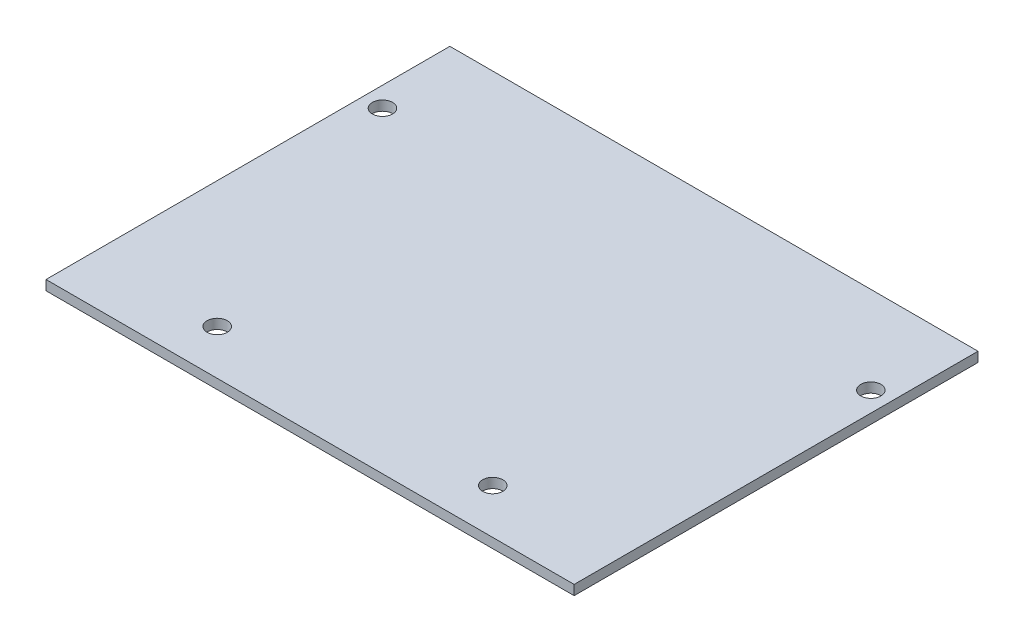
ISO-10303-21;
HEADER;
FILE_DESCRIPTION(('STEP AP214'),'2;1');
FILE_NAME('part.step','',(''),(''),'','','');
FILE_SCHEMA(('AUTOMOTIVE_DESIGN { 1 0 10303 214 1 1 1 1 }'));
ENDSEC;
DATA;
#1=APPLICATION_CONTEXT('core data for automotive mechanical design processes');
#2=APPLICATION_PROTOCOL_DEFINITION('international standard','automotive_design',2000,#1);
#3=PRODUCT_CONTEXT('',#1,'mechanical');
#4=PRODUCT('Part','Part','',(#3));
#5=PRODUCT_RELATED_PRODUCT_CATEGORY('part','',(#4));
#6=PRODUCT_DEFINITION_FORMATION('','',#4);
#7=PRODUCT_DEFINITION_CONTEXT('part definition',#1,'design');
#8=PRODUCT_DEFINITION('design','',#6,#7);
#9=PRODUCT_DEFINITION_SHAPE('','',#8);
#10=(LENGTH_UNIT() NAMED_UNIT(*) SI_UNIT(.MILLI.,.METRE.));
#11=(NAMED_UNIT(*) PLANE_ANGLE_UNIT() SI_UNIT($,.RADIAN.));
#12=(NAMED_UNIT(*) SI_UNIT($,.STERADIAN.) SOLID_ANGLE_UNIT());
#13=UNCERTAINTY_MEASURE_WITH_UNIT(LENGTH_MEASURE(1.E-05),#10,'distance_accuracy_value','');
#14=(GEOMETRIC_REPRESENTATION_CONTEXT(3) GLOBAL_UNCERTAINTY_ASSIGNED_CONTEXT((#13)) GLOBAL_UNIT_ASSIGNED_CONTEXT((#10,
#11,#12)) REPRESENTATION_CONTEXT('',''));
#15=CARTESIAN_POINT('',(0.,0.,0.));
#16=DIRECTION('',(0.,0.,1.));
#17=DIRECTION('',(1.,0.,0.));
#18=AXIS2_PLACEMENT_3D('',#15,#16,#17);
#19=CARTESIAN_POINT('',(0.,1.6,0.));
#20=DIRECTION('',(0.,-1.,0.));
#21=DIRECTION('',(0.,0.,-1.));
#22=AXIS2_PLACEMENT_3D('',#19,#20,#21);
#23=PLANE('',#22);
#24=DIRECTION('',(0.,0.,-1.));
#25=VECTOR('',#24,1.);
#26=CARTESIAN_POINT('',(43.18,1.6,33.02));
#27=LINE('',#26,#25);
#28=CARTESIAN_POINT('',(43.18,1.6,33.02));
#29=VERTEX_POINT('',#28);
#30=CARTESIAN_POINT('',(43.18,1.6,-33.02));
#31=VERTEX_POINT('',#30);
#32=EDGE_CURVE('E92',#29,#31,#27,.T.);
#33=ORIENTED_EDGE('',*,*,#32,.T.);
#34=DIRECTION('',(-1.,0.,0.));
#35=VECTOR('',#34,1.);
#36=CARTESIAN_POINT('',(-43.18,1.6,-33.02));
#37=LINE('',#36,#35);
#38=CARTESIAN_POINT('',(-43.18,1.6,-33.02));
#39=VERTEX_POINT('',#38);
#40=EDGE_CURVE('E87',#31,#39,#37,.T.);
#41=ORIENTED_EDGE('',*,*,#40,.T.);
#42=DIRECTION('',(0.,0.,1.));
#43=VECTOR('',#42,1.);
#44=CARTESIAN_POINT('',(-43.18,1.6,33.02));
#45=LINE('',#44,#43);
#46=CARTESIAN_POINT('',(-43.18,1.6,33.02));
#47=VERTEX_POINT('',#46);
#48=EDGE_CURVE('E90',#39,#47,#45,.T.);
#49=ORIENTED_EDGE('',*,*,#48,.T.);
#50=DIRECTION('',(1.,0.,0.));
#51=VECTOR('',#50,1.);
#52=CARTESIAN_POINT('',(-43.18,1.6,33.02));
#53=LINE('',#52,#51);
#54=EDGE_CURVE('E57',#47,#29,#53,.T.);
#55=ORIENTED_EDGE('',*,*,#54,.T.);
#56=EDGE_LOOP('',(#33,#41,#49,#55));
#57=FACE_BOUND('',#56,.T.);
#58=CARTESIAN_POINT('',(-22.5298,1.6,25.6794));
#59=DIRECTION('',(0.,1.,0.));
#60=DIRECTION('',(0.,0.,1.));
#61=AXIS2_PLACEMENT_3D('',#58,#59,#60);
#62=CIRCLE('',#61,1.65);
#63=CARTESIAN_POINT('',(-22.5298,1.6,27.3294));
#64=VERTEX_POINT('',#63);
#65=EDGE_CURVE('E112',#64,#64,#62,.T.);
#66=ORIENTED_EDGE('',*,*,#65,.F.);
#67=EDGE_LOOP('',(#66));
#68=FACE_BOUND('',#67,.T.);
#69=CARTESIAN_POINT('',(-39.9288,1.6,-18.7452));
#70=DIRECTION('',(0.,1.,0.));
#71=DIRECTION('',(0.,0.,1.));
#72=AXIS2_PLACEMENT_3D('',#69,#70,#71);
#73=CIRCLE('',#72,1.65);
#74=CARTESIAN_POINT('',(-39.9288,1.6,-17.0952));
#75=VERTEX_POINT('',#74);
#76=EDGE_CURVE('E134',#75,#75,#73,.T.);
#77=ORIENTED_EDGE('',*,*,#76,.F.);
#78=EDGE_LOOP('',(#77));
#79=FACE_BOUND('',#78,.T.);
#80=CARTESIAN_POINT('',(39.9288,1.6,-18.7452));
#81=DIRECTION('',(0.,1.,0.));
#82=DIRECTION('',(0.,0.,-1.));
#83=AXIS2_PLACEMENT_3D('',#80,#81,#82);
#84=CIRCLE('',#83,1.65);
#85=CARTESIAN_POINT('',(39.9288,1.6,-20.3952));
#86=VERTEX_POINT('',#85);
#87=EDGE_CURVE('E142',#86,#86,#84,.T.);
#88=ORIENTED_EDGE('',*,*,#87,.F.);
#89=EDGE_LOOP('',(#88));
#90=FACE_BOUND('',#89,.T.);
#91=CARTESIAN_POINT('',(22.5298,1.6,25.6794));
#92=DIRECTION('',(0.,1.,0.));
#93=DIRECTION('',(0.,0.,-1.));
#94=AXIS2_PLACEMENT_3D('',#91,#92,#93);
#95=CIRCLE('',#94,1.65);
#96=CARTESIAN_POINT('',(22.5298,1.6,24.0294));
#97=VERTEX_POINT('',#96);
#98=EDGE_CURVE('E150',#97,#97,#95,.T.);
#99=ORIENTED_EDGE('',*,*,#98,.F.);
#100=EDGE_LOOP('',(#99));
#101=FACE_BOUND('',#100,.T.);
#102=ADVANCED_FACE('F39',(#57,#68,#79,#90,#101),#23,.F.);
#103=CARTESIAN_POINT('',(0.,0.,0.));
#104=DIRECTION('',(0.,-1.,0.));
#105=DIRECTION('',(0.,0.,-1.));
#106=AXIS2_PLACEMENT_3D('',#103,#104,#105);
#107=PLANE('',#106);
#108=CARTESIAN_POINT('',(39.9288,0.,-18.7452));
#109=DIRECTION('',(0.,1.,0.));
#110=DIRECTION('',(0.,0.,-1.));
#111=AXIS2_PLACEMENT_3D('',#108,#109,#110);
#112=CIRCLE('',#111,1.65);
#113=CARTESIAN_POINT('',(39.9288,0.,-20.3952));
#114=VERTEX_POINT('',#113);
#115=EDGE_CURVE('E146',#114,#114,#112,.T.);
#116=ORIENTED_EDGE('',*,*,#115,.T.);
#117=EDGE_LOOP('',(#116));
#118=FACE_BOUND('',#117,.T.);
#119=CARTESIAN_POINT('',(-22.5298,0.,25.6794));
#120=DIRECTION('',(0.,1.,0.));
#121=DIRECTION('',(0.,0.,1.));
#122=AXIS2_PLACEMENT_3D('',#119,#120,#121);
#123=CIRCLE('',#122,1.65);
#124=CARTESIAN_POINT('',(-22.5298,0.,27.3294));
#125=VERTEX_POINT('',#124);
#126=EDGE_CURVE('E130',#125,#125,#123,.T.);
#127=ORIENTED_EDGE('',*,*,#126,.T.);
#128=EDGE_LOOP('',(#127));
#129=FACE_BOUND('',#128,.T.);
#130=DIRECTION('',(0.,0.,-1.));
#131=VECTOR('',#130,1.);
#132=CARTESIAN_POINT('',(43.18,0.,33.02));
#133=LINE('',#132,#131);
#134=CARTESIAN_POINT('',(43.18,0.,33.02));
#135=VERTEX_POINT('',#134);
#136=CARTESIAN_POINT('',(43.18,0.,-33.02));
#137=VERTEX_POINT('',#136);
#138=EDGE_CURVE('E108',#135,#137,#133,.T.);
#139=ORIENTED_EDGE('',*,*,#138,.F.);
#140=DIRECTION('',(1.,0.,0.));
#141=VECTOR('',#140,1.);
#142=CARTESIAN_POINT('',(-43.18,0.,33.02));
#143=LINE('',#142,#141);
#144=CARTESIAN_POINT('',(-43.18,0.,33.02));
#145=VERTEX_POINT('',#144);
#146=EDGE_CURVE('E80',#145,#135,#143,.T.);
#147=ORIENTED_EDGE('',*,*,#146,.F.);
#148=DIRECTION('',(0.,0.,1.));
#149=VECTOR('',#148,1.);
#150=CARTESIAN_POINT('',(-43.18,0.,33.02));
#151=LINE('',#150,#149);
#152=CARTESIAN_POINT('',(-43.18,0.,-33.02));
#153=VERTEX_POINT('',#152);
#154=EDGE_CURVE('E74',#153,#145,#151,.T.);
#155=ORIENTED_EDGE('',*,*,#154,.F.);
#156=DIRECTION('',(-1.,0.,0.));
#157=VECTOR('',#156,1.);
#158=CARTESIAN_POINT('',(-43.18,0.,-33.02));
#159=LINE('',#158,#157);
#160=EDGE_CURVE('E97',#137,#153,#159,.T.);
#161=ORIENTED_EDGE('',*,*,#160,.F.);
#162=EDGE_LOOP('',(#139,#147,#155,#161));
#163=FACE_BOUND('',#162,.T.);
#164=CARTESIAN_POINT('',(-39.9288,0.,-18.7452));
#165=DIRECTION('',(0.,1.,0.));
#166=DIRECTION('',(0.,0.,1.));
#167=AXIS2_PLACEMENT_3D('',#164,#165,#166);
#168=CIRCLE('',#167,1.65);
#169=CARTESIAN_POINT('',(-39.9288,0.,-17.0952));
#170=VERTEX_POINT('',#169);
#171=EDGE_CURVE('E138',#170,#170,#168,.T.);
#172=ORIENTED_EDGE('',*,*,#171,.T.);
#173=EDGE_LOOP('',(#172));
#174=FACE_BOUND('',#173,.T.);
#175=CARTESIAN_POINT('',(22.5298,0.,25.6794));
#176=DIRECTION('',(0.,1.,0.));
#177=DIRECTION('',(0.,0.,-1.));
#178=AXIS2_PLACEMENT_3D('',#175,#176,#177);
#179=CIRCLE('',#178,1.65);
#180=CARTESIAN_POINT('',(22.5298,0.,24.0294));
#181=VERTEX_POINT('',#180);
#182=EDGE_CURVE('E154',#181,#181,#179,.T.);
#183=ORIENTED_EDGE('',*,*,#182,.T.);
#184=EDGE_LOOP('',(#183));
#185=FACE_BOUND('',#184,.T.);
#186=ADVANCED_FACE('F125',(#118,#129,#163,#174,#185),#107,.T.);
#187=CARTESIAN_POINT('',(43.18,1.6,33.02));
#188=DIRECTION('',(-1.,0.,0.));
#189=DIRECTION('',(0.,0.,1.));
#190=AXIS2_PLACEMENT_3D('',#187,#188,#189);
#191=PLANE('',#190);
#192=ORIENTED_EDGE('',*,*,#138,.T.);
#193=DIRECTION('',(0.,-1.,0.));
#194=VECTOR('',#193,1.);
#195=CARTESIAN_POINT('',(43.18,1.6,-33.02));
#196=LINE('',#195,#194);
#197=EDGE_CURVE('E11',#31,#137,#196,.T.);
#198=ORIENTED_EDGE('',*,*,#197,.F.);
#199=ORIENTED_EDGE('',*,*,#32,.F.);
#200=DIRECTION('',(0.,-1.,0.));
#201=VECTOR('',#200,1.);
#202=CARTESIAN_POINT('',(43.18,1.6,33.02));
#203=LINE('',#202,#201);
#204=EDGE_CURVE('E104',#29,#135,#203,.T.);
#205=ORIENTED_EDGE('',*,*,#204,.T.);
#206=EDGE_LOOP('',(#192,#198,#199,#205));
#207=FACE_BOUND('',#206,.T.);
#208=ADVANCED_FACE('F41',(#207),#191,.F.);
#209=CARTESIAN_POINT('',(-43.18,1.6,-33.02));
#210=DIRECTION('',(0.,0.,1.));
#211=DIRECTION('',(1.,0.,0.));
#212=AXIS2_PLACEMENT_3D('',#209,#210,#211);
#213=PLANE('',#212);
#214=ORIENTED_EDGE('',*,*,#160,.T.);
#215=DIRECTION('',(0.,-1.,0.));
#216=VECTOR('',#215,1.);
#217=CARTESIAN_POINT('',(-43.18,1.6,-33.02));
#218=LINE('',#217,#216);
#219=EDGE_CURVE('E49',#39,#153,#218,.T.);
#220=ORIENTED_EDGE('',*,*,#219,.F.);
#221=ORIENTED_EDGE('',*,*,#40,.F.);
#222=ORIENTED_EDGE('',*,*,#197,.T.);
#223=EDGE_LOOP('',(#214,#220,#221,#222));
#224=FACE_BOUND('',#223,.T.);
#225=ADVANCED_FACE('F96',(#224),#213,.F.);
#226=CARTESIAN_POINT('',(-43.18,1.6,33.02));
#227=DIRECTION('',(1.,0.,0.));
#228=DIRECTION('',(0.,0.,-1.));
#229=AXIS2_PLACEMENT_3D('',#226,#227,#228);
#230=PLANE('',#229);
#231=ORIENTED_EDGE('',*,*,#154,.T.);
#232=DIRECTION('',(0.,-1.,0.));
#233=VECTOR('',#232,1.);
#234=CARTESIAN_POINT('',(-43.18,1.6,33.02));
#235=LINE('',#234,#233);
#236=EDGE_CURVE('E99',#47,#145,#235,.T.);
#237=ORIENTED_EDGE('',*,*,#236,.F.);
#238=ORIENTED_EDGE('',*,*,#48,.F.);
#239=ORIENTED_EDGE('',*,*,#219,.T.);
#240=EDGE_LOOP('',(#231,#237,#238,#239));
#241=FACE_BOUND('',#240,.T.);
#242=ADVANCED_FACE('F100',(#241),#230,.F.);
#243=CARTESIAN_POINT('',(-43.18,1.6,33.02));
#244=DIRECTION('',(0.,0.,-1.));
#245=DIRECTION('',(-1.,0.,0.));
#246=AXIS2_PLACEMENT_3D('',#243,#244,#245);
#247=PLANE('',#246);
#248=ORIENTED_EDGE('',*,*,#146,.T.);
#249=ORIENTED_EDGE('',*,*,#204,.F.);
#250=ORIENTED_EDGE('',*,*,#54,.F.);
#251=ORIENTED_EDGE('',*,*,#236,.T.);
#252=EDGE_LOOP('',(#248,#249,#250,#251));
#253=FACE_BOUND('',#252,.T.);
#254=ADVANCED_FACE('F122',(#253),#247,.F.);
#255=CARTESIAN_POINT('',(-22.5298,1.6,25.6794));
#256=DIRECTION('',(0.,-1.,0.));
#257=DIRECTION('',(0.,0.,-1.));
#258=AXIS2_PLACEMENT_3D('',#255,#256,#257);
#259=CYLINDRICAL_SURFACE('',#258,1.65);
#260=ORIENTED_EDGE('',*,*,#65,.T.);
#261=EDGE_LOOP('',(#260));
#262=FACE_BOUND('',#261,.T.);
#263=ORIENTED_EDGE('',*,*,#126,.F.);
#264=EDGE_LOOP('',(#263));
#265=FACE_BOUND('',#264,.T.);
#266=ADVANCED_FACE('F173',(#262,#265),#259,.F.);
#267=CARTESIAN_POINT('',(-39.9288,1.6,-18.7452));
#268=DIRECTION('',(0.,-1.,0.));
#269=DIRECTION('',(0.,0.,-1.));
#270=AXIS2_PLACEMENT_3D('',#267,#268,#269);
#271=CYLINDRICAL_SURFACE('',#270,1.65);
#272=ORIENTED_EDGE('',*,*,#76,.T.);
#273=EDGE_LOOP('',(#272));
#274=FACE_BOUND('',#273,.T.);
#275=ORIENTED_EDGE('',*,*,#171,.F.);
#276=EDGE_LOOP('',(#275));
#277=FACE_BOUND('',#276,.T.);
#278=ADVANCED_FACE('F219',(#274,#277),#271,.F.);
#279=CARTESIAN_POINT('',(39.9288,1.6,-18.7452));
#280=DIRECTION('',(0.,-1.,0.));
#281=DIRECTION('',(0.,0.,-1.));
#282=AXIS2_PLACEMENT_3D('',#279,#280,#281);
#283=CYLINDRICAL_SURFACE('',#282,1.65);
#284=ORIENTED_EDGE('',*,*,#87,.T.);
#285=EDGE_LOOP('',(#284));
#286=FACE_BOUND('',#285,.T.);
#287=ORIENTED_EDGE('',*,*,#115,.F.);
#288=EDGE_LOOP('',(#287));
#289=FACE_BOUND('',#288,.T.);
#290=ADVANCED_FACE('F227',(#286,#289),#283,.F.);
#291=CARTESIAN_POINT('',(22.5298,1.6,25.6794));
#292=DIRECTION('',(0.,-1.,0.));
#293=DIRECTION('',(0.,0.,-1.));
#294=AXIS2_PLACEMENT_3D('',#291,#292,#293);
#295=CYLINDRICAL_SURFACE('',#294,1.65);
#296=ORIENTED_EDGE('',*,*,#98,.T.);
#297=EDGE_LOOP('',(#296));
#298=FACE_BOUND('',#297,.T.);
#299=ORIENTED_EDGE('',*,*,#182,.F.);
#300=EDGE_LOOP('',(#299));
#301=FACE_BOUND('',#300,.T.);
#302=ADVANCED_FACE('F162',(#298,#301),#295,.F.);
#303=CLOSED_SHELL('',(#102,#186,#208,#225,#242,#254,#266,#278,#290,#302));
#304=MANIFOLD_SOLID_BREP('B2',#303);
#305=ADVANCED_BREP_SHAPE_REPRESENTATION('',(#18,#304),#14);
#306=SHAPE_DEFINITION_REPRESENTATION(#9,#305);
ENDSEC;
END-ISO-10303-21;
